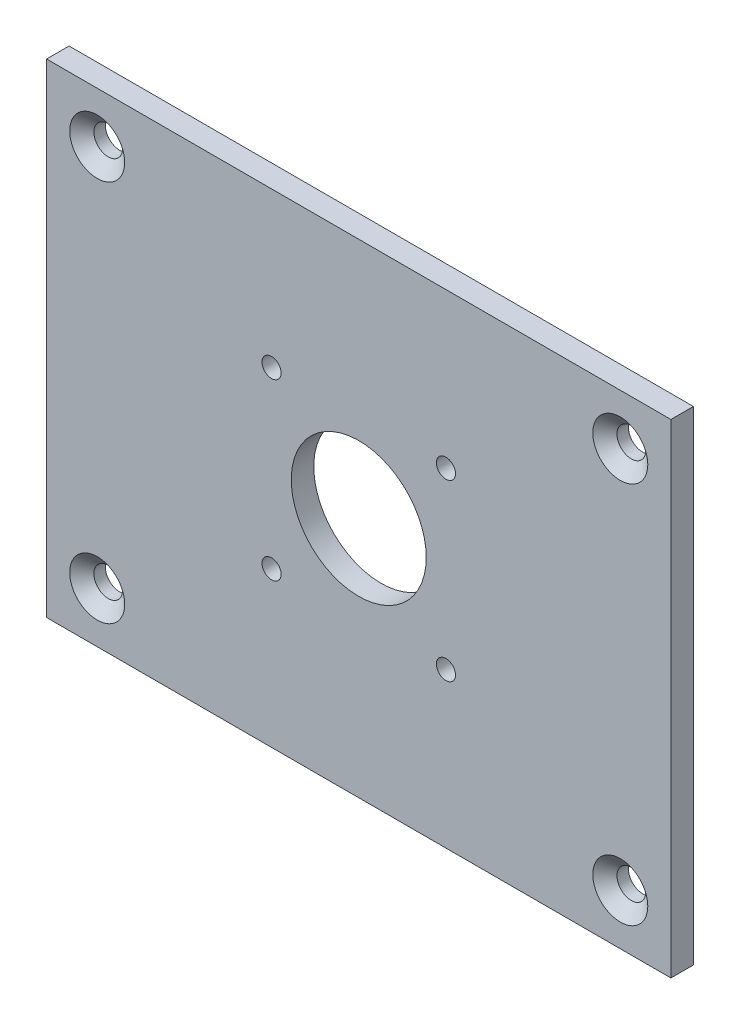
ISO-10303-21;
HEADER;
FILE_DESCRIPTION(('STEP AP214'),'2;1');
FILE_NAME('part.step','',(''),(''),'','','');
FILE_SCHEMA(('AUTOMOTIVE_DESIGN { 1 0 10303 214 1 1 1 1 }'));
ENDSEC;
DATA;
#1=APPLICATION_CONTEXT('core data for automotive mechanical design processes');
#2=APPLICATION_PROTOCOL_DEFINITION('international standard','automotive_design',2000,#1);
#3=PRODUCT_CONTEXT('',#1,'mechanical');
#4=PRODUCT('Part','Part','',(#3));
#5=PRODUCT_RELATED_PRODUCT_CATEGORY('part','',(#4));
#6=PRODUCT_DEFINITION_FORMATION('','',#4);
#7=PRODUCT_DEFINITION_CONTEXT('part definition',#1,'design');
#8=PRODUCT_DEFINITION('design','',#6,#7);
#9=PRODUCT_DEFINITION_SHAPE('','',#8);
#10=(LENGTH_UNIT() NAMED_UNIT(*) SI_UNIT(.MILLI.,.METRE.));
#11=(NAMED_UNIT(*) PLANE_ANGLE_UNIT() SI_UNIT($,.RADIAN.));
#12=(NAMED_UNIT(*) SI_UNIT($,.STERADIAN.) SOLID_ANGLE_UNIT());
#13=UNCERTAINTY_MEASURE_WITH_UNIT(LENGTH_MEASURE(1.E-05),#10,'distance_accuracy_value','');
#14=(GEOMETRIC_REPRESENTATION_CONTEXT(3) GLOBAL_UNCERTAINTY_ASSIGNED_CONTEXT((#13)) GLOBAL_UNIT_ASSIGNED_CONTEXT((#10,
#11,#12)) REPRESENTATION_CONTEXT('',''));
#15=CARTESIAN_POINT('',(0.,0.,0.));
#16=DIRECTION('',(0.,0.,1.));
#17=DIRECTION('',(1.,0.,0.));
#18=AXIS2_PLACEMENT_3D('',#15,#16,#17);
#19=CARTESIAN_POINT('',(0.,0.,4.));
#20=DIRECTION('',(1.,0.,0.));
#21=DIRECTION('',(0.,0.,-1.));
#22=AXIS2_PLACEMENT_3D('',#19,#20,#21);
#23=PLANE('',#22);
#24=DIRECTION('',(0.,-1.,0.));
#25=VECTOR('',#24,1.);
#26=CARTESIAN_POINT('',(0.,0.,0.));
#27=LINE('',#26,#25);
#28=CARTESIAN_POINT('',(0.,86.,0.));
#29=VERTEX_POINT('',#28);
#30=CARTESIAN_POINT('',(0.,0.,0.));
#31=VERTEX_POINT('',#30);
#32=EDGE_CURVE('E99',#29,#31,#27,.T.);
#33=ORIENTED_EDGE('',*,*,#32,.T.);
#34=DIRECTION('',(0.,0.,-1.));
#35=VECTOR('',#34,1.);
#36=CARTESIAN_POINT('',(0.,0.,4.));
#37=LINE('',#36,#35);
#38=CARTESIAN_POINT('',(0.,0.,4.));
#39=VERTEX_POINT('',#38);
#40=EDGE_CURVE('E11',#39,#31,#37,.T.);
#41=ORIENTED_EDGE('',*,*,#40,.F.);
#42=DIRECTION('',(0.,-1.,0.));
#43=VECTOR('',#42,1.);
#44=CARTESIAN_POINT('',(0.,0.,4.));
#45=LINE('',#44,#43);
#46=CARTESIAN_POINT('',(0.,86.,4.));
#47=VERTEX_POINT('',#46);
#48=EDGE_CURVE('E87',#47,#39,#45,.T.);
#49=ORIENTED_EDGE('',*,*,#48,.F.);
#50=DIRECTION('',(0.,0.,-1.));
#51=VECTOR('',#50,1.);
#52=CARTESIAN_POINT('',(0.,86.,4.));
#53=LINE('',#52,#51);
#54=EDGE_CURVE('E95',#47,#29,#53,.T.);
#55=ORIENTED_EDGE('',*,*,#54,.T.);
#56=EDGE_LOOP('',(#33,#41,#49,#55));
#57=FACE_BOUND('',#56,.T.);
#58=ADVANCED_FACE('F36',(#57),#23,.F.);
#59=CARTESIAN_POINT('',(0.,0.,4.));
#60=DIRECTION('',(0.,1.,0.));
#61=DIRECTION('',(0.,0.,1.));
#62=AXIS2_PLACEMENT_3D('',#59,#60,#61);
#63=PLANE('',#62);
#64=DIRECTION('',(1.,0.,0.));
#65=VECTOR('',#64,1.);
#66=CARTESIAN_POINT('',(0.,0.,0.));
#67=LINE('',#66,#65);
#68=CARTESIAN_POINT('',(111.,0.,0.));
#69=VERTEX_POINT('',#68);
#70=EDGE_CURVE('E91',#31,#69,#67,.T.);
#71=ORIENTED_EDGE('',*,*,#70,.T.);
#72=DIRECTION('',(0.,0.,-1.));
#73=VECTOR('',#72,1.);
#74=CARTESIAN_POINT('',(111.,0.,4.));
#75=LINE('',#74,#73);
#76=CARTESIAN_POINT('',(111.,0.,4.));
#77=VERTEX_POINT('',#76);
#78=EDGE_CURVE('E44',#77,#69,#75,.T.);
#79=ORIENTED_EDGE('',*,*,#78,.F.);
#80=DIRECTION('',(1.,0.,0.));
#81=VECTOR('',#80,1.);
#82=CARTESIAN_POINT('',(0.,0.,4.));
#83=LINE('',#82,#81);
#84=EDGE_CURVE('E82',#39,#77,#83,.T.);
#85=ORIENTED_EDGE('',*,*,#84,.F.);
#86=ORIENTED_EDGE('',*,*,#40,.T.);
#87=EDGE_LOOP('',(#71,#79,#85,#86));
#88=FACE_BOUND('',#87,.T.);
#89=ADVANCED_FACE('F90',(#88),#63,.F.);
#90=CARTESIAN_POINT('',(111.,0.,4.));
#91=DIRECTION('',(-1.,0.,0.));
#92=DIRECTION('',(0.,0.,1.));
#93=AXIS2_PLACEMENT_3D('',#90,#91,#92);
#94=PLANE('',#93);
#95=DIRECTION('',(0.,1.,0.));
#96=VECTOR('',#95,1.);
#97=CARTESIAN_POINT('',(111.,0.,0.));
#98=LINE('',#97,#96);
#99=CARTESIAN_POINT('',(111.,86.,0.));
#100=VERTEX_POINT('',#99);
#101=EDGE_CURVE('E69',#69,#100,#98,.T.);
#102=ORIENTED_EDGE('',*,*,#101,.T.);
#103=DIRECTION('',(0.,0.,-1.));
#104=VECTOR('',#103,1.);
#105=CARTESIAN_POINT('',(111.,86.,4.));
#106=LINE('',#105,#104);
#107=CARTESIAN_POINT('',(111.,86.,4.));
#108=VERTEX_POINT('',#107);
#109=EDGE_CURVE('E92',#108,#100,#106,.T.);
#110=ORIENTED_EDGE('',*,*,#109,.F.);
#111=DIRECTION('',(0.,1.,0.));
#112=VECTOR('',#111,1.);
#113=CARTESIAN_POINT('',(111.,0.,4.));
#114=LINE('',#113,#112);
#115=EDGE_CURVE('E85',#77,#108,#114,.T.);
#116=ORIENTED_EDGE('',*,*,#115,.F.);
#117=ORIENTED_EDGE('',*,*,#78,.T.);
#118=EDGE_LOOP('',(#102,#110,#116,#117));
#119=FACE_BOUND('',#118,.T.);
#120=ADVANCED_FACE('F93',(#119),#94,.F.);
#121=CARTESIAN_POINT('',(0.,86.,4.));
#122=DIRECTION('',(0.,-1.,0.));
#123=DIRECTION('',(0.,0.,-1.));
#124=AXIS2_PLACEMENT_3D('',#121,#122,#123);
#125=PLANE('',#124);
#126=DIRECTION('',(-1.,0.,0.));
#127=VECTOR('',#126,1.);
#128=CARTESIAN_POINT('',(0.,86.,0.));
#129=LINE('',#128,#127);
#130=EDGE_CURVE('E75',#100,#29,#129,.T.);
#131=ORIENTED_EDGE('',*,*,#130,.T.);
#132=ORIENTED_EDGE('',*,*,#54,.F.);
#133=DIRECTION('',(-1.,0.,0.));
#134=VECTOR('',#133,1.);
#135=CARTESIAN_POINT('',(0.,86.,4.));
#136=LINE('',#135,#134);
#137=EDGE_CURVE('E52',#108,#47,#136,.T.);
#138=ORIENTED_EDGE('',*,*,#137,.F.);
#139=ORIENTED_EDGE('',*,*,#109,.T.);
#140=EDGE_LOOP('',(#131,#132,#138,#139));
#141=FACE_BOUND('',#140,.T.);
#142=ADVANCED_FACE('F107',(#141),#125,.F.);
#143=CARTESIAN_POINT('',(0.,0.,4.));
#144=DIRECTION('',(0.,0.,-1.));
#145=DIRECTION('',(-1.,0.,0.));
#146=AXIS2_PLACEMENT_3D('',#143,#144,#145);
#147=PLANE('',#146);
#148=CARTESIAN_POINT('',(9.,77.,4.));
#149=DIRECTION('',(0.,0.,1.));
#150=DIRECTION('',(1.,0.,0.));
#151=AXIS2_PLACEMENT_3D('',#148,#149,#150);
#152=CIRCLE('',#151,4.8895);
#153=CARTESIAN_POINT('',(13.8895,77.,4.));
#154=VERTEX_POINT('',#153);
#155=EDGE_CURVE('E175',#154,#154,#152,.T.);
#156=ORIENTED_EDGE('',*,*,#155,.F.);
#157=EDGE_LOOP('',(#156));
#158=FACE_BOUND('',#157,.T.);
#159=CARTESIAN_POINT('',(102.,9.00000000000002,4.));
#160=DIRECTION('',(0.,0.,1.));
#161=DIRECTION('',(1.,0.,0.));
#162=AXIS2_PLACEMENT_3D('',#159,#160,#161);
#163=CIRCLE('',#162,4.88950000000001);
#164=CARTESIAN_POINT('',(106.8895,9.00000000000002,4.));
#165=VERTEX_POINT('',#164);
#166=EDGE_CURVE('E166',#165,#165,#163,.T.);
#167=ORIENTED_EDGE('',*,*,#166,.F.);
#168=EDGE_LOOP('',(#167));
#169=FACE_BOUND('',#168,.T.);
#170=CARTESIAN_POINT('',(9.00000000000001,8.99999999999999,4.));
#171=DIRECTION('',(0.,0.,1.));
#172=DIRECTION('',(1.,0.,0.));
#173=AXIS2_PLACEMENT_3D('',#170,#171,#172);
#174=CIRCLE('',#173,4.8895);
#175=CARTESIAN_POINT('',(13.8895,8.99999999999999,4.));
#176=VERTEX_POINT('',#175);
#177=EDGE_CURVE('E157',#176,#176,#174,.T.);
#178=ORIENTED_EDGE('',*,*,#177,.F.);
#179=EDGE_LOOP('',(#178));
#180=FACE_BOUND('',#179,.T.);
#181=CARTESIAN_POINT('',(102.,77.,4.));
#182=DIRECTION('',(0.,0.,1.));
#183=DIRECTION('',(1.,0.,0.));
#184=AXIS2_PLACEMENT_3D('',#181,#182,#183);
#185=CIRCLE('',#184,4.88950000000001);
#186=CARTESIAN_POINT('',(106.8895,77.,4.));
#187=VERTEX_POINT('',#186);
#188=EDGE_CURVE('E148',#187,#187,#185,.T.);
#189=ORIENTED_EDGE('',*,*,#188,.F.);
#190=EDGE_LOOP('',(#189));
#191=FACE_BOUND('',#190,.T.);
#192=CARTESIAN_POINT('',(55.5,43.,4.));
#193=DIRECTION('',(0.,0.,1.));
#194=DIRECTION('',(1.,0.,0.));
#195=AXIS2_PLACEMENT_3D('',#192,#193,#194);
#196=CIRCLE('',#195,12.);
#197=CARTESIAN_POINT('',(67.5,43.,4.));
#198=VERTEX_POINT('',#197);
#199=EDGE_CURVE('E137',#198,#198,#196,.T.);
#200=ORIENTED_EDGE('',*,*,#199,.F.);
#201=EDGE_LOOP('',(#200));
#202=FACE_BOUND('',#201,.T.);
#203=CARTESIAN_POINT('',(40.,58.5,4.));
#204=DIRECTION('',(0.,0.,1.));
#205=DIRECTION('',(1.,0.,0.));
#206=AXIS2_PLACEMENT_3D('',#203,#204,#205);
#207=CIRCLE('',#206,1.7);
#208=CARTESIAN_POINT('',(41.7,58.5,4.));
#209=VERTEX_POINT('',#208);
#210=EDGE_CURVE('E133',#209,#209,#207,.T.);
#211=ORIENTED_EDGE('',*,*,#210,.F.);
#212=EDGE_LOOP('',(#211));
#213=FACE_BOUND('',#212,.T.);
#214=CARTESIAN_POINT('',(71.,27.5,4.));
#215=DIRECTION('',(0.,0.,1.));
#216=DIRECTION('',(1.,0.,0.));
#217=AXIS2_PLACEMENT_3D('',#214,#215,#216);
#218=CIRCLE('',#217,1.69999999999999);
#219=CARTESIAN_POINT('',(72.7,27.5,4.));
#220=VERTEX_POINT('',#219);
#221=EDGE_CURVE('E127',#220,#220,#218,.T.);
#222=ORIENTED_EDGE('',*,*,#221,.F.);
#223=EDGE_LOOP('',(#222));
#224=FACE_BOUND('',#223,.T.);
#225=CARTESIAN_POINT('',(40.,27.5,4.));
#226=DIRECTION('',(0.,0.,1.));
#227=DIRECTION('',(1.,0.,0.));
#228=AXIS2_PLACEMENT_3D('',#225,#226,#227);
#229=CIRCLE('',#228,1.7);
#230=CARTESIAN_POINT('',(41.7,27.5,4.));
#231=VERTEX_POINT('',#230);
#232=EDGE_CURVE('E121',#231,#231,#229,.T.);
#233=ORIENTED_EDGE('',*,*,#232,.F.);
#234=EDGE_LOOP('',(#233));
#235=FACE_BOUND('',#234,.T.);
#236=CARTESIAN_POINT('',(71.,58.5,4.));
#237=DIRECTION('',(0.,0.,1.));
#238=DIRECTION('',(1.,0.,0.));
#239=AXIS2_PLACEMENT_3D('',#236,#237,#238);
#240=CIRCLE('',#239,1.69999999999999);
#241=CARTESIAN_POINT('',(72.7,58.5,4.));
#242=VERTEX_POINT('',#241);
#243=EDGE_CURVE('E115',#242,#242,#240,.T.);
#244=ORIENTED_EDGE('',*,*,#243,.F.);
#245=EDGE_LOOP('',(#244));
#246=FACE_BOUND('',#245,.T.);
#247=ORIENTED_EDGE('',*,*,#48,.T.);
#248=ORIENTED_EDGE('',*,*,#84,.T.);
#249=ORIENTED_EDGE('',*,*,#115,.T.);
#250=ORIENTED_EDGE('',*,*,#137,.T.);
#251=EDGE_LOOP('',(#247,#248,#249,#250));
#252=FACE_BOUND('',#251,.T.);
#253=ADVANCED_FACE('F83',(#158,#169,#180,#191,#202,#213,#224,#235,#246,#252),#147,.F.);
#254=CARTESIAN_POINT('',(0.,0.,0.));
#255=DIRECTION('',(0.,0.,-1.));
#256=DIRECTION('',(-1.,0.,0.));
#257=AXIS2_PLACEMENT_3D('',#254,#255,#256);
#258=PLANE('',#257);
#259=CARTESIAN_POINT('',(9.,77.,0.));
#260=DIRECTION('',(0.,0.,1.));
#261=DIRECTION('',(1.,0.,0.));
#262=AXIS2_PLACEMENT_3D('',#259,#260,#261);
#263=CIRCLE('',#262,2.5527);
#264=CARTESIAN_POINT('',(11.5527,77.,0.));
#265=VERTEX_POINT('',#264);
#266=EDGE_CURVE('E169',#265,#265,#263,.T.);
#267=ORIENTED_EDGE('',*,*,#266,.T.);
#268=EDGE_LOOP('',(#267));
#269=FACE_BOUND('',#268,.T.);
#270=CARTESIAN_POINT('',(102.,9.00000000000002,0.));
#271=DIRECTION('',(0.,0.,1.));
#272=DIRECTION('',(1.,0.,0.));
#273=AXIS2_PLACEMENT_3D('',#270,#271,#272);
#274=CIRCLE('',#273,2.55270000000001);
#275=CARTESIAN_POINT('',(104.5527,9.00000000000002,0.));
#276=VERTEX_POINT('',#275);
#277=EDGE_CURVE('E160',#276,#276,#274,.T.);
#278=ORIENTED_EDGE('',*,*,#277,.T.);
#279=EDGE_LOOP('',(#278));
#280=FACE_BOUND('',#279,.T.);
#281=CARTESIAN_POINT('',(9.00000000000001,8.99999999999999,0.));
#282=DIRECTION('',(0.,0.,1.));
#283=DIRECTION('',(1.,0.,0.));
#284=AXIS2_PLACEMENT_3D('',#281,#282,#283);
#285=CIRCLE('',#284,2.5527);
#286=CARTESIAN_POINT('',(11.5527,8.99999999999999,0.));
#287=VERTEX_POINT('',#286);
#288=EDGE_CURVE('E151',#287,#287,#285,.T.);
#289=ORIENTED_EDGE('',*,*,#288,.T.);
#290=EDGE_LOOP('',(#289));
#291=FACE_BOUND('',#290,.T.);
#292=CARTESIAN_POINT('',(102.,77.,0.));
#293=DIRECTION('',(0.,0.,1.));
#294=DIRECTION('',(1.,0.,0.));
#295=AXIS2_PLACEMENT_3D('',#292,#293,#294);
#296=CIRCLE('',#295,2.55270000000001);
#297=CARTESIAN_POINT('',(104.5527,77.,0.));
#298=VERTEX_POINT('',#297);
#299=EDGE_CURVE('E140',#298,#298,#296,.T.);
#300=ORIENTED_EDGE('',*,*,#299,.T.);
#301=EDGE_LOOP('',(#300));
#302=FACE_BOUND('',#301,.T.);
#303=CARTESIAN_POINT('',(55.5,43.,0.));
#304=DIRECTION('',(0.,0.,1.));
#305=DIRECTION('',(1.,0.,0.));
#306=AXIS2_PLACEMENT_3D('',#303,#304,#305);
#307=CIRCLE('',#306,12.);
#308=CARTESIAN_POINT('',(67.5,43.,0.));
#309=VERTEX_POINT('',#308);
#310=EDGE_CURVE('E136',#309,#309,#307,.T.);
#311=ORIENTED_EDGE('',*,*,#310,.T.);
#312=EDGE_LOOP('',(#311));
#313=FACE_BOUND('',#312,.T.);
#314=CARTESIAN_POINT('',(40.,58.5,0.));
#315=DIRECTION('',(0.,0.,1.));
#316=DIRECTION('',(1.,0.,0.));
#317=AXIS2_PLACEMENT_3D('',#314,#315,#316);
#318=CIRCLE('',#317,1.7);
#319=CARTESIAN_POINT('',(41.7,58.5,0.));
#320=VERTEX_POINT('',#319);
#321=EDGE_CURVE('E130',#320,#320,#318,.T.);
#322=ORIENTED_EDGE('',*,*,#321,.T.);
#323=EDGE_LOOP('',(#322));
#324=FACE_BOUND('',#323,.T.);
#325=CARTESIAN_POINT('',(71.,27.5,0.));
#326=DIRECTION('',(0.,0.,1.));
#327=DIRECTION('',(1.,0.,0.));
#328=AXIS2_PLACEMENT_3D('',#325,#326,#327);
#329=CIRCLE('',#328,1.69999999999999);
#330=CARTESIAN_POINT('',(72.7,27.5,0.));
#331=VERTEX_POINT('',#330);
#332=EDGE_CURVE('E124',#331,#331,#329,.T.);
#333=ORIENTED_EDGE('',*,*,#332,.T.);
#334=EDGE_LOOP('',(#333));
#335=FACE_BOUND('',#334,.T.);
#336=CARTESIAN_POINT('',(40.,27.5,0.));
#337=DIRECTION('',(0.,0.,1.));
#338=DIRECTION('',(1.,0.,0.));
#339=AXIS2_PLACEMENT_3D('',#336,#337,#338);
#340=CIRCLE('',#339,1.7);
#341=CARTESIAN_POINT('',(41.7,27.5,0.));
#342=VERTEX_POINT('',#341);
#343=EDGE_CURVE('E118',#342,#342,#340,.T.);
#344=ORIENTED_EDGE('',*,*,#343,.T.);
#345=EDGE_LOOP('',(#344));
#346=FACE_BOUND('',#345,.T.);
#347=CARTESIAN_POINT('',(71.,58.5,0.));
#348=DIRECTION('',(0.,0.,1.));
#349=DIRECTION('',(1.,0.,0.));
#350=AXIS2_PLACEMENT_3D('',#347,#348,#349);
#351=CIRCLE('',#350,1.69999999999999);
#352=CARTESIAN_POINT('',(72.7,58.5,0.));
#353=VERTEX_POINT('',#352);
#354=EDGE_CURVE('E102',#353,#353,#351,.T.);
#355=ORIENTED_EDGE('',*,*,#354,.T.);
#356=EDGE_LOOP('',(#355));
#357=FACE_BOUND('',#356,.T.);
#358=ORIENTED_EDGE('',*,*,#32,.F.);
#359=ORIENTED_EDGE('',*,*,#130,.F.);
#360=ORIENTED_EDGE('',*,*,#101,.F.);
#361=ORIENTED_EDGE('',*,*,#70,.F.);
#362=EDGE_LOOP('',(#358,#359,#360,#361));
#363=FACE_BOUND('',#362,.T.);
#364=ADVANCED_FACE('F110',(#269,#280,#291,#302,#313,#324,#335,#346,#357,#363),#258,.T.);
#365=CARTESIAN_POINT('',(71.,58.5,4.));
#366=DIRECTION('',(0.,0.,1.));
#367=DIRECTION('',(1.,0.,0.));
#368=AXIS2_PLACEMENT_3D('',#365,#366,#367);
#369=CYLINDRICAL_SURFACE('',#368,1.69999999999999);
#370=ORIENTED_EDGE('',*,*,#354,.F.);
#371=EDGE_LOOP('',(#370));
#372=FACE_BOUND('',#371,.T.);
#373=ORIENTED_EDGE('',*,*,#243,.T.);
#374=EDGE_LOOP('',(#373));
#375=FACE_BOUND('',#374,.T.);
#376=ADVANCED_FACE('F200',(#372,#375),#369,.F.);
#377=CARTESIAN_POINT('',(40.,27.5,4.));
#378=DIRECTION('',(0.,0.,1.));
#379=DIRECTION('',(1.,0.,0.));
#380=AXIS2_PLACEMENT_3D('',#377,#378,#379);
#381=CYLINDRICAL_SURFACE('',#380,1.7);
#382=ORIENTED_EDGE('',*,*,#343,.F.);
#383=EDGE_LOOP('',(#382));
#384=FACE_BOUND('',#383,.T.);
#385=ORIENTED_EDGE('',*,*,#232,.T.);
#386=EDGE_LOOP('',(#385));
#387=FACE_BOUND('',#386,.T.);
#388=ADVANCED_FACE('F202',(#384,#387),#381,.F.);
#389=CARTESIAN_POINT('',(71.,27.5,4.));
#390=DIRECTION('',(0.,0.,1.));
#391=DIRECTION('',(1.,0.,0.));
#392=AXIS2_PLACEMENT_3D('',#389,#390,#391);
#393=CYLINDRICAL_SURFACE('',#392,1.69999999999999);
#394=ORIENTED_EDGE('',*,*,#332,.F.);
#395=EDGE_LOOP('',(#394));
#396=FACE_BOUND('',#395,.T.);
#397=ORIENTED_EDGE('',*,*,#221,.T.);
#398=EDGE_LOOP('',(#397));
#399=FACE_BOUND('',#398,.T.);
#400=ADVANCED_FACE('F209',(#396,#399),#393,.F.);
#401=CARTESIAN_POINT('',(40.,58.5,4.));
#402=DIRECTION('',(0.,0.,1.));
#403=DIRECTION('',(1.,0.,0.));
#404=AXIS2_PLACEMENT_3D('',#401,#402,#403);
#405=CYLINDRICAL_SURFACE('',#404,1.7);
#406=ORIENTED_EDGE('',*,*,#321,.F.);
#407=EDGE_LOOP('',(#406));
#408=FACE_BOUND('',#407,.T.);
#409=ORIENTED_EDGE('',*,*,#210,.T.);
#410=EDGE_LOOP('',(#409));
#411=FACE_BOUND('',#410,.T.);
#412=ADVANCED_FACE('F331',(#408,#411),#405,.F.);
#413=CARTESIAN_POINT('',(55.5,43.,0.));
#414=DIRECTION('',(0.,0.,1.));
#415=DIRECTION('',(1.,0.,0.));
#416=AXIS2_PLACEMENT_3D('',#413,#414,#415);
#417=CYLINDRICAL_SURFACE('',#416,12.);
#418=ORIENTED_EDGE('',*,*,#310,.F.);
#419=EDGE_LOOP('',(#418));
#420=FACE_BOUND('',#419,.T.);
#421=ORIENTED_EDGE('',*,*,#199,.T.);
#422=EDGE_LOOP('',(#421));
#423=FACE_BOUND('',#422,.T.);
#424=ADVANCED_FACE('F253',(#420,#423),#417,.F.);
#425=CARTESIAN_POINT('',(102.,77.,4.));
#426=DIRECTION('',(0.,0.,1.));
#427=DIRECTION('',(1.,0.,0.));
#428=AXIS2_PLACEMENT_3D('',#425,#426,#427);
#429=CYLINDRICAL_SURFACE('',#428,2.55270000000001);
#430=ORIENTED_EDGE('',*,*,#299,.F.);
#431=EDGE_LOOP('',(#430));
#432=FACE_BOUND('',#431,.T.);
#433=CARTESIAN_POINT('',(102.,77.,2.03919198186493));
#434=DIRECTION('',(0.,0.,1.));
#435=DIRECTION('',(1.,0.,0.));
#436=AXIS2_PLACEMENT_3D('',#433,#434,#435);
#437=CIRCLE('',#436,2.55270000000001);
#438=CARTESIAN_POINT('',(104.5527,77.,2.03919198186493));
#439=VERTEX_POINT('',#438);
#440=EDGE_CURVE('E145',#439,#439,#437,.T.);
#441=ORIENTED_EDGE('',*,*,#440,.T.);
#442=EDGE_LOOP('',(#441));
#443=FACE_BOUND('',#442,.T.);
#444=ADVANCED_FACE('F247',(#432,#443),#429,.F.);
#445=CARTESIAN_POINT('',(102.,77.,4.));
#446=DIRECTION('',(0.,0.,1.));
#447=DIRECTION('',(1.,0.,0.));
#448=AXIS2_PLACEMENT_3D('',#445,#446,#447);
#449=CONICAL_SURFACE('',#448,4.88950000000001,0.872664625997164);
#450=ORIENTED_EDGE('',*,*,#440,.F.);
#451=EDGE_LOOP('',(#450));
#452=FACE_BOUND('',#451,.T.);
#453=ORIENTED_EDGE('',*,*,#188,.T.);
#454=EDGE_LOOP('',(#453));
#455=FACE_BOUND('',#454,.T.);
#456=ADVANCED_FACE('F252',(#452,#455),#449,.F.);
#457=CARTESIAN_POINT('',(9.00000000000001,8.99999999999999,4.));
#458=DIRECTION('',(0.,0.,1.));
#459=DIRECTION('',(1.,0.,0.));
#460=AXIS2_PLACEMENT_3D('',#457,#458,#459);
#461=CYLINDRICAL_SURFACE('',#460,2.5527);
#462=ORIENTED_EDGE('',*,*,#288,.F.);
#463=EDGE_LOOP('',(#462));
#464=FACE_BOUND('',#463,.T.);
#465=CARTESIAN_POINT('',(9.00000000000001,8.99999999999999,2.03919198186493));
#466=DIRECTION('',(0.,0.,1.));
#467=DIRECTION('',(1.,0.,0.));
#468=AXIS2_PLACEMENT_3D('',#465,#466,#467);
#469=CIRCLE('',#468,2.5527);
#470=CARTESIAN_POINT('',(11.5527,8.99999999999999,2.03919198186493));
#471=VERTEX_POINT('',#470);
#472=EDGE_CURVE('E154',#471,#471,#469,.T.);
#473=ORIENTED_EDGE('',*,*,#472,.T.);
#474=EDGE_LOOP('',(#473));
#475=FACE_BOUND('',#474,.T.);
#476=ADVANCED_FACE('F265',(#464,#475),#461,.F.);
#477=CARTESIAN_POINT('',(9.00000000000001,8.99999999999999,4.));
#478=DIRECTION('',(0.,0.,1.));
#479=DIRECTION('',(1.,0.,0.));
#480=AXIS2_PLACEMENT_3D('',#477,#478,#479);
#481=CONICAL_SURFACE('',#480,4.8895,0.872664625997164);
#482=ORIENTED_EDGE('',*,*,#472,.F.);
#483=EDGE_LOOP('',(#482));
#484=FACE_BOUND('',#483,.T.);
#485=ORIENTED_EDGE('',*,*,#177,.T.);
#486=EDGE_LOOP('',(#485));
#487=FACE_BOUND('',#486,.T.);
#488=ADVANCED_FACE('F275',(#484,#487),#481,.F.);
#489=CARTESIAN_POINT('',(102.,9.00000000000002,4.));
#490=DIRECTION('',(0.,0.,1.));
#491=DIRECTION('',(1.,0.,0.));
#492=AXIS2_PLACEMENT_3D('',#489,#490,#491);
#493=CYLINDRICAL_SURFACE('',#492,2.55270000000001);
#494=ORIENTED_EDGE('',*,*,#277,.F.);
#495=EDGE_LOOP('',(#494));
#496=FACE_BOUND('',#495,.T.);
#497=CARTESIAN_POINT('',(102.,9.00000000000002,2.03919198186493));
#498=DIRECTION('',(0.,0.,1.));
#499=DIRECTION('',(1.,0.,0.));
#500=AXIS2_PLACEMENT_3D('',#497,#498,#499);
#501=CIRCLE('',#500,2.55270000000001);
#502=CARTESIAN_POINT('',(104.5527,9.00000000000002,2.03919198186493));
#503=VERTEX_POINT('',#502);
#504=EDGE_CURVE('E163',#503,#503,#501,.T.);
#505=ORIENTED_EDGE('',*,*,#504,.T.);
#506=EDGE_LOOP('',(#505));
#507=FACE_BOUND('',#506,.T.);
#508=ADVANCED_FACE('F285',(#496,#507),#493,.F.);
#509=CARTESIAN_POINT('',(102.,9.00000000000002,4.));
#510=DIRECTION('',(0.,0.,1.));
#511=DIRECTION('',(1.,0.,0.));
#512=AXIS2_PLACEMENT_3D('',#509,#510,#511);
#513=CONICAL_SURFACE('',#512,4.88950000000001,0.872664625997164);
#514=ORIENTED_EDGE('',*,*,#504,.F.);
#515=EDGE_LOOP('',(#514));
#516=FACE_BOUND('',#515,.T.);
#517=ORIENTED_EDGE('',*,*,#166,.T.);
#518=EDGE_LOOP('',(#517));
#519=FACE_BOUND('',#518,.T.);
#520=ADVANCED_FACE('F295',(#516,#519),#513,.F.);
#521=CARTESIAN_POINT('',(9.,77.,4.));
#522=DIRECTION('',(0.,0.,1.));
#523=DIRECTION('',(1.,0.,0.));
#524=AXIS2_PLACEMENT_3D('',#521,#522,#523);
#525=CYLINDRICAL_SURFACE('',#524,2.5527);
#526=ORIENTED_EDGE('',*,*,#266,.F.);
#527=EDGE_LOOP('',(#526));
#528=FACE_BOUND('',#527,.T.);
#529=CARTESIAN_POINT('',(9.,77.,2.03919198186493));
#530=DIRECTION('',(0.,0.,1.));
#531=DIRECTION('',(1.,0.,0.));
#532=AXIS2_PLACEMENT_3D('',#529,#530,#531);
#533=CIRCLE('',#532,2.5527);
#534=CARTESIAN_POINT('',(11.5527,77.,2.03919198186493));
#535=VERTEX_POINT('',#534);
#536=EDGE_CURVE('E172',#535,#535,#533,.T.);
#537=ORIENTED_EDGE('',*,*,#536,.T.);
#538=EDGE_LOOP('',(#537));
#539=FACE_BOUND('',#538,.T.);
#540=ADVANCED_FACE('F305',(#528,#539),#525,.F.);
#541=CARTESIAN_POINT('',(9.,77.,4.));
#542=DIRECTION('',(0.,0.,1.));
#543=DIRECTION('',(1.,0.,0.));
#544=AXIS2_PLACEMENT_3D('',#541,#542,#543);
#545=CONICAL_SURFACE('',#544,4.8895,0.872664625997164);
#546=ORIENTED_EDGE('',*,*,#536,.F.);
#547=EDGE_LOOP('',(#546));
#548=FACE_BOUND('',#547,.T.);
#549=ORIENTED_EDGE('',*,*,#155,.T.);
#550=EDGE_LOOP('',(#549));
#551=FACE_BOUND('',#550,.T.);
#552=ADVANCED_FACE('F179',(#548,#551),#545,.F.);
#553=CLOSED_SHELL('',(#58,#89,#120,#142,#253,#364,#376,#388,#400,#412,#424,#444,#456,#476,#488,
#508,#520,#540,#552));
#554=MANIFOLD_SOLID_BREP('B2',#553);
#555=ADVANCED_BREP_SHAPE_REPRESENTATION('',(#18,#554),#14);
#556=SHAPE_DEFINITION_REPRESENTATION(#9,#555);
ENDSEC;
END-ISO-10303-21;
